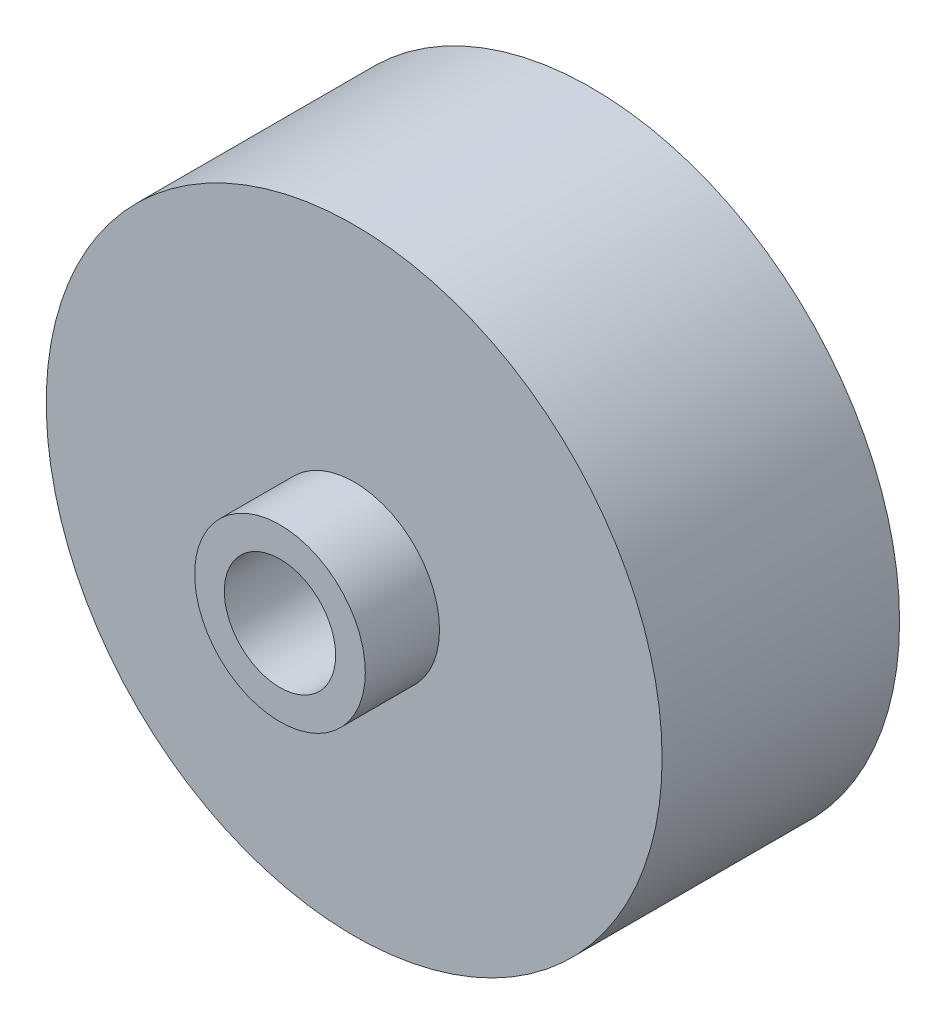
ISO-10303-21;
HEADER;
FILE_DESCRIPTION(('STEP AP214'),'2;1');
FILE_NAME('part.step','',(''),(''),'','','');
FILE_SCHEMA(('AUTOMOTIVE_DESIGN { 1 0 10303 214 1 1 1 1 }'));
ENDSEC;
DATA;
#1=APPLICATION_CONTEXT('core data for automotive mechanical design processes');
#2=APPLICATION_PROTOCOL_DEFINITION('international standard','automotive_design',2000,#1);
#3=PRODUCT_CONTEXT('',#1,'mechanical');
#4=PRODUCT('Part','Part','',(#3));
#5=PRODUCT_RELATED_PRODUCT_CATEGORY('part','',(#4));
#6=PRODUCT_DEFINITION_FORMATION('','',#4);
#7=PRODUCT_DEFINITION_CONTEXT('part definition',#1,'design');
#8=PRODUCT_DEFINITION('design','',#6,#7);
#9=PRODUCT_DEFINITION_SHAPE('','',#8);
#10=(LENGTH_UNIT() NAMED_UNIT(*) SI_UNIT(.MILLI.,.METRE.));
#11=(NAMED_UNIT(*) PLANE_ANGLE_UNIT() SI_UNIT($,.RADIAN.));
#12=(NAMED_UNIT(*) SI_UNIT($,.STERADIAN.) SOLID_ANGLE_UNIT());
#13=UNCERTAINTY_MEASURE_WITH_UNIT(LENGTH_MEASURE(1.E-05),#10,'distance_accuracy_value','');
#14=(GEOMETRIC_REPRESENTATION_CONTEXT(3) GLOBAL_UNCERTAINTY_ASSIGNED_CONTEXT((#13)) GLOBAL_UNIT_ASSIGNED_CONTEXT((#10,
#11,#12)) REPRESENTATION_CONTEXT('',''));
#15=CARTESIAN_POINT('',(0.,0.,0.));
#16=DIRECTION('',(0.,0.,1.));
#17=DIRECTION('',(1.,0.,0.));
#18=AXIS2_PLACEMENT_3D('',#15,#16,#17);
#19=CARTESIAN_POINT('',(0.,0.,0.));
#20=DIRECTION('',(0.,0.,1.));
#21=DIRECTION('',(1.,0.,0.));
#22=AXIS2_PLACEMENT_3D('',#19,#20,#21);
#23=CYLINDRICAL_SURFACE('',#22,3.75);
#24=CARTESIAN_POINT('',(0.,0.,21.));
#25=DIRECTION('',(0.,0.,1.));
#26=DIRECTION('',(1.,0.,0.));
#27=AXIS2_PLACEMENT_3D('',#24,#25,#26);
#28=CIRCLE('',#27,3.75);
#29=CARTESIAN_POINT('',(3.75,0.,21.));
#30=VERTEX_POINT('',#29);
#31=EDGE_CURVE('E10',#30,#30,#28,.T.);
#32=ORIENTED_EDGE('',*,*,#31,.T.);
#33=EDGE_LOOP('',(#32));
#34=FACE_BOUND('',#33,.T.);
#35=CARTESIAN_POINT('',(0.,0.,0.));
#36=DIRECTION('',(0.,0.,1.));
#37=DIRECTION('',(1.,0.,0.));
#38=AXIS2_PLACEMENT_3D('',#35,#36,#37);
#39=CIRCLE('',#38,3.75);
#40=CARTESIAN_POINT('',(3.75,0.,0.));
#41=VERTEX_POINT('',#40);
#42=EDGE_CURVE('E55',#41,#41,#39,.T.);
#43=ORIENTED_EDGE('',*,*,#42,.F.);
#44=EDGE_LOOP('',(#43));
#45=FACE_BOUND('',#44,.T.);
#46=ADVANCED_FACE('F33',(#34,#45),#23,.F.);
#47=CARTESIAN_POINT('',(3.75,0.,21.));
#48=DIRECTION('',(0.,0.,1.));
#49=DIRECTION('',(1.,0.,0.));
#50=AXIS2_PLACEMENT_3D('',#47,#48,#49);
#51=PLANE('',#50);
#52=CARTESIAN_POINT('',(0.,0.,21.));
#53=DIRECTION('',(0.,0.,1.));
#54=DIRECTION('',(1.,0.,0.));
#55=AXIS2_PLACEMENT_3D('',#52,#53,#54);
#56=CIRCLE('',#55,5.75);
#57=CARTESIAN_POINT('',(5.75,0.,21.));
#58=VERTEX_POINT('',#57);
#59=EDGE_CURVE('E39',#58,#58,#56,.T.);
#60=ORIENTED_EDGE('',*,*,#59,.T.);
#61=EDGE_LOOP('',(#60));
#62=FACE_BOUND('',#61,.T.);
#63=ORIENTED_EDGE('',*,*,#31,.F.);
#64=EDGE_LOOP('',(#63));
#65=FACE_BOUND('',#64,.T.);
#66=ADVANCED_FACE('F63',(#62,#65),#51,.T.);
#67=CARTESIAN_POINT('',(0.,0.,0.));
#68=DIRECTION('',(0.,0.,1.));
#69=DIRECTION('',(1.,0.,0.));
#70=AXIS2_PLACEMENT_3D('',#67,#68,#69);
#71=CYLINDRICAL_SURFACE('',#70,5.75);
#72=CARTESIAN_POINT('',(0.,0.,16.));
#73=DIRECTION('',(0.,0.,1.));
#74=DIRECTION('',(1.,0.,0.));
#75=AXIS2_PLACEMENT_3D('',#72,#73,#74);
#76=CIRCLE('',#75,5.75);
#77=CARTESIAN_POINT('',(5.75,0.,16.));
#78=VERTEX_POINT('',#77);
#79=EDGE_CURVE('E43',#78,#78,#76,.T.);
#80=ORIENTED_EDGE('',*,*,#79,.T.);
#81=EDGE_LOOP('',(#80));
#82=FACE_BOUND('',#81,.T.);
#83=ORIENTED_EDGE('',*,*,#59,.F.);
#84=EDGE_LOOP('',(#83));
#85=FACE_BOUND('',#84,.T.);
#86=ADVANCED_FACE('F67',(#82,#85),#71,.T.);
#87=CARTESIAN_POINT('',(5.75,0.,16.));
#88=DIRECTION('',(0.,0.,1.));
#89=DIRECTION('',(1.,0.,0.));
#90=AXIS2_PLACEMENT_3D('',#87,#88,#89);
#91=PLANE('',#90);
#92=CARTESIAN_POINT('',(0.,0.,16.));
#93=DIRECTION('',(0.,0.,1.));
#94=DIRECTION('',(1.,0.,0.));
#95=AXIS2_PLACEMENT_3D('',#92,#93,#94);
#96=CIRCLE('',#95,20.75);
#97=CARTESIAN_POINT('',(20.75,0.,16.));
#98=VERTEX_POINT('',#97);
#99=EDGE_CURVE('E47',#98,#98,#96,.T.);
#100=ORIENTED_EDGE('',*,*,#99,.T.);
#101=EDGE_LOOP('',(#100));
#102=FACE_BOUND('',#101,.T.);
#103=ORIENTED_EDGE('',*,*,#79,.F.);
#104=EDGE_LOOP('',(#103));
#105=FACE_BOUND('',#104,.T.);
#106=ADVANCED_FACE('F71',(#102,#105),#91,.T.);
#107=CARTESIAN_POINT('',(0.,0.,0.));
#108=DIRECTION('',(0.,0.,1.));
#109=DIRECTION('',(1.,0.,0.));
#110=AXIS2_PLACEMENT_3D('',#107,#108,#109);
#111=CYLINDRICAL_SURFACE('',#110,20.75);
#112=CARTESIAN_POINT('',(0.,0.,0.));
#113=DIRECTION('',(0.,0.,1.));
#114=DIRECTION('',(1.,0.,0.));
#115=AXIS2_PLACEMENT_3D('',#112,#113,#114);
#116=CIRCLE('',#115,20.75);
#117=CARTESIAN_POINT('',(20.75,0.,0.));
#118=VERTEX_POINT('',#117);
#119=EDGE_CURVE('E52',#118,#118,#116,.T.);
#120=ORIENTED_EDGE('',*,*,#119,.T.);
#121=EDGE_LOOP('',(#120));
#122=FACE_BOUND('',#121,.T.);
#123=ORIENTED_EDGE('',*,*,#99,.F.);
#124=EDGE_LOOP('',(#123));
#125=FACE_BOUND('',#124,.T.);
#126=ADVANCED_FACE('F78',(#122,#125),#111,.T.);
#127=CARTESIAN_POINT('',(20.75,0.,0.));
#128=DIRECTION('',(0.,0.,-1.));
#129=DIRECTION('',(-1.,0.,0.));
#130=AXIS2_PLACEMENT_3D('',#127,#128,#129);
#131=PLANE('',#130);
#132=ORIENTED_EDGE('',*,*,#42,.T.);
#133=EDGE_LOOP('',(#132));
#134=FACE_BOUND('',#133,.T.);
#135=ORIENTED_EDGE('',*,*,#119,.F.);
#136=EDGE_LOOP('',(#135));
#137=FACE_BOUND('',#136,.T.);
#138=ADVANCED_FACE('F59',(#134,#137),#131,.T.);
#139=CLOSED_SHELL('',(#46,#66,#86,#106,#126,#138));
#140=MANIFOLD_SOLID_BREP('B2',#139);
#141=ADVANCED_BREP_SHAPE_REPRESENTATION('',(#18,#140),#14);
#142=SHAPE_DEFINITION_REPRESENTATION(#9,#141);
ENDSEC;
END-ISO-10303-21;
